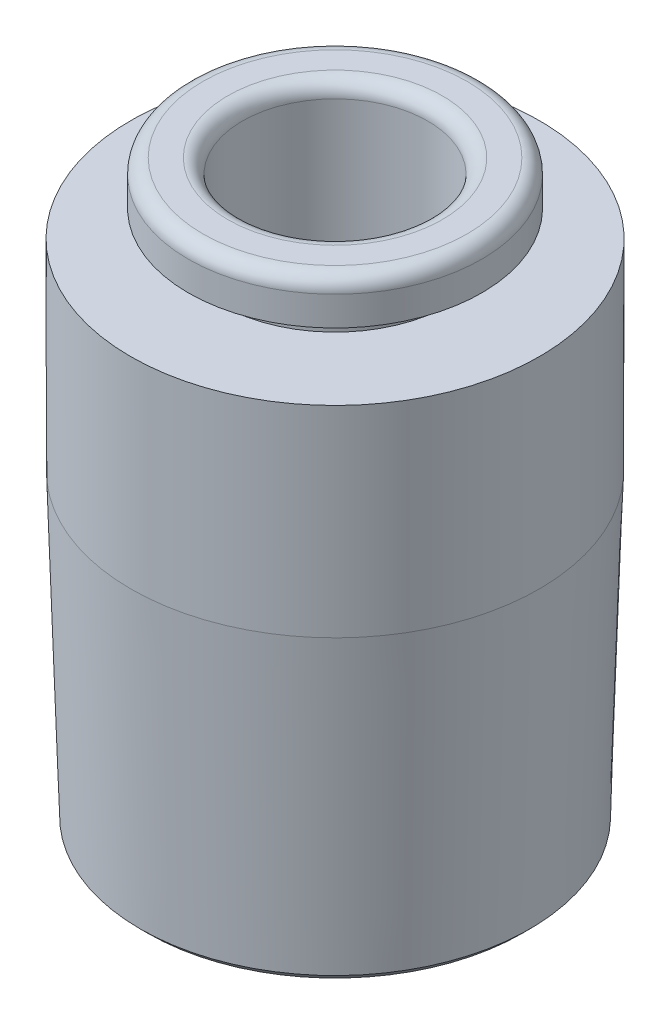
ISO-10303-21;
HEADER;
FILE_DESCRIPTION(('STEP AP214'),'2;1');
FILE_NAME('part.step','',(''),(''),'','','');
FILE_SCHEMA(('AUTOMOTIVE_DESIGN { 1 0 10303 214 1 1 1 1 }'));
ENDSEC;
DATA;
#1=APPLICATION_CONTEXT('core data for automotive mechanical design processes');
#2=APPLICATION_PROTOCOL_DEFINITION('international standard','automotive_design',2000,#1);
#3=PRODUCT_CONTEXT('',#1,'mechanical');
#4=PRODUCT('Part','Part','',(#3));
#5=PRODUCT_RELATED_PRODUCT_CATEGORY('part','',(#4));
#6=PRODUCT_DEFINITION_FORMATION('','',#4);
#7=PRODUCT_DEFINITION_CONTEXT('part definition',#1,'design');
#8=PRODUCT_DEFINITION('design','',#6,#7);
#9=PRODUCT_DEFINITION_SHAPE('','',#8);
#10=(LENGTH_UNIT() NAMED_UNIT(*) SI_UNIT(.MILLI.,.METRE.));
#11=(NAMED_UNIT(*) PLANE_ANGLE_UNIT() SI_UNIT($,.RADIAN.));
#12=(NAMED_UNIT(*) SI_UNIT($,.STERADIAN.) SOLID_ANGLE_UNIT());
#13=UNCERTAINTY_MEASURE_WITH_UNIT(LENGTH_MEASURE(1.E-05),#10,'distance_accuracy_value','');
#14=(GEOMETRIC_REPRESENTATION_CONTEXT(3) GLOBAL_UNCERTAINTY_ASSIGNED_CONTEXT((#13)) GLOBAL_UNIT_ASSIGNED_CONTEXT((#10,
#11,#12)) REPRESENTATION_CONTEXT('',''));
#15=CARTESIAN_POINT('',(0.,0.,0.));
#16=DIRECTION('',(0.,0.,1.));
#17=DIRECTION('',(1.,0.,0.));
#18=AXIS2_PLACEMENT_3D('',#15,#16,#17);
#19=CARTESIAN_POINT('',(0.,-15.3,4.76));
#20=DIRECTION('',(0.,-1.,0.));
#21=DIRECTION('',(0.,0.,-1.));
#22=AXIS2_PLACEMENT_3D('',#19,#20,#21);
#23=PLANE('',#22);
#24=DIRECTION('',(-1.,0.,0.));
#25=VECTOR('',#24,1.);
#26=CARTESIAN_POINT('',(1.37409364067131,-15.3,-2.3101584610165));
#27=LINE('',#26,#25);
#28=CARTESIAN_POINT('',(1.33377060933857,-15.3,-2.3101584610165));
#29=VERTEX_POINT('',#28);
#30=CARTESIAN_POINT('',(0.,-15.3,-2.3101584610165));
#31=VERTEX_POINT('',#30);
#32=EDGE_CURVE('E149',#29,#31,#27,.T.);
#33=ORIENTED_EDGE('',*,*,#32,.T.);
#34=CARTESIAN_POINT('',(0.,-15.3,0.));
#35=DIRECTION('',(0.,-1.,0.));
#36=DIRECTION('',(0.,0.,-1.));
#37=AXIS2_PLACEMENT_3D('',#34,#35,#36);
#38=CIRCLE('',#37,2.3101584610165);
#39=CARTESIAN_POINT('',(2.00065591400786,-15.3,-1.15507923050825));
#40=VERTEX_POINT('',#39);
#41=EDGE_CURVE('E11',#31,#40,#38,.T.);
#42=ORIENTED_EDGE('',*,*,#41,.T.);
#43=DIRECTION('',(-0.5,0.,-0.866025403784439));
#44=VECTOR('',#43,1.);
#45=CARTESIAN_POINT('',(2.68770273434351,-15.3,0.0349207694917477));
#46=LINE('',#45,#44);
#47=EDGE_CURVE('E156',#40,#29,#46,.T.);
#48=ORIENTED_EDGE('',*,*,#47,.T.);
#49=EDGE_LOOP('',(#33,#42,#48));
#50=FACE_BOUND('',#49,.T.);
#51=ADVANCED_FACE('F37',(#50),#23,.F.);
#52=CARTESIAN_POINT('',(2.66754121867714,-15.3,0.));
#53=VERTEX_POINT('',#52);
#54=EDGE_CURVE('E153',#53,#40,#46,.T.);
#55=ORIENTED_EDGE('',*,*,#54,.T.);
#56=CARTESIAN_POINT('',(2.00065591400786,-15.3,1.15507923050825));
#57=VERTEX_POINT('',#56);
#58=EDGE_CURVE('E46',#40,#57,#38,.T.);
#59=ORIENTED_EDGE('',*,*,#58,.T.);
#60=DIRECTION('',(0.5,0.,-0.866025403784438));
#61=VECTOR('',#60,1.);
#62=CARTESIAN_POINT('',(1.3136090936722,-15.3,2.34507923050825));
#63=LINE('',#62,#61);
#64=EDGE_CURVE('E255',#57,#53,#63,.T.);
#65=ORIENTED_EDGE('',*,*,#64,.T.);
#66=EDGE_LOOP('',(#55,#59,#65));
#67=FACE_BOUND('',#66,.T.);
#68=ADVANCED_FACE('F277',(#67),#23,.F.);
#69=CARTESIAN_POINT('',(1.33377060933857,-15.3,2.3101584610165));
#70=VERTEX_POINT('',#69);
#71=EDGE_CURVE('E123',#70,#57,#63,.T.);
#72=ORIENTED_EDGE('',*,*,#71,.T.);
#73=CARTESIAN_POINT('',(0.,-15.3,0.));
#74=DIRECTION('',(0.,1.,0.));
#75=DIRECTION('',(0.,0.,1.));
#76=AXIS2_PLACEMENT_3D('',#73,#74,#75);
#77=CIRCLE('',#76,2.3101584610165);
#78=CARTESIAN_POINT('',(0.,-15.3,2.3101584610165));
#79=VERTEX_POINT('',#78);
#80=EDGE_CURVE('E109',#79,#57,#77,.T.);
#81=ORIENTED_EDGE('',*,*,#80,.F.);
#82=DIRECTION('',(1.,0.,0.));
#83=VECTOR('',#82,1.);
#84=CARTESIAN_POINT('',(-1.37409364067131,-15.3,2.3101584610165));
#85=LINE('',#84,#83);
#86=EDGE_CURVE('E120',#79,#70,#85,.T.);
#87=ORIENTED_EDGE('',*,*,#86,.T.);
#88=EDGE_LOOP('',(#72,#81,#87));
#89=FACE_BOUND('',#88,.T.);
#90=ADVANCED_FACE('F119',(#89),#23,.F.);
#91=CARTESIAN_POINT('',(-1.33377060933857,-15.3,2.3101584610165));
#92=VERTEX_POINT('',#91);
#93=EDGE_CURVE('E130',#92,#79,#85,.T.);
#94=ORIENTED_EDGE('',*,*,#93,.T.);
#95=CARTESIAN_POINT('',(-2.00065591400786,-15.3,1.15507923050825));
#96=VERTEX_POINT('',#95);
#97=EDGE_CURVE('E106',#79,#96,#38,.T.);
#98=ORIENTED_EDGE('',*,*,#97,.T.);
#99=DIRECTION('',(0.5,0.,0.866025403784439));
#100=VECTOR('',#99,1.);
#101=CARTESIAN_POINT('',(-2.68770273434351,-15.3,-0.0349207694917475));
#102=LINE('',#101,#100);
#103=EDGE_CURVE('E135',#96,#92,#102,.T.);
#104=ORIENTED_EDGE('',*,*,#103,.T.);
#105=EDGE_LOOP('',(#94,#98,#104));
#106=FACE_BOUND('',#105,.T.);
#107=ADVANCED_FACE('F134',(#106),#23,.F.);
#108=CARTESIAN_POINT('',(-2.66754121867714,-15.3,0.));
#109=VERTEX_POINT('',#108);
#110=EDGE_CURVE('E132',#109,#96,#102,.T.);
#111=ORIENTED_EDGE('',*,*,#110,.T.);
#112=CARTESIAN_POINT('',(-2.00065591400786,-15.3,-1.15507923050825));
#113=VERTEX_POINT('',#112);
#114=EDGE_CURVE('E112',#96,#113,#38,.T.);
#115=ORIENTED_EDGE('',*,*,#114,.T.);
#116=DIRECTION('',(-0.5,0.,0.866025403784439));
#117=VECTOR('',#116,1.);
#118=CARTESIAN_POINT('',(-1.3136090936722,-15.3,-2.34507923050825));
#119=LINE('',#118,#117);
#120=EDGE_CURVE('E148',#113,#109,#119,.T.);
#121=ORIENTED_EDGE('',*,*,#120,.T.);
#122=EDGE_LOOP('',(#111,#115,#121));
#123=FACE_BOUND('',#122,.T.);
#124=ADVANCED_FACE('F228',(#123),#23,.F.);
#125=CARTESIAN_POINT('',(0.,0.,0.));
#126=DIRECTION('',(0.,1.,0.));
#127=DIRECTION('',(0.,0.,1.));
#128=AXIS2_PLACEMENT_3D('',#125,#126,#127);
#129=CYLINDRICAL_SURFACE('',#128,3.925);
#130=CARTESIAN_POINT('',(0.,-2.4,0.));
#131=DIRECTION('',(0.,1.,0.));
#132=DIRECTION('',(0.,0.,1.));
#133=AXIS2_PLACEMENT_3D('',#130,#131,#132);
#134=CIRCLE('',#133,3.925);
#135=CARTESIAN_POINT('',(0.,-2.4,3.925));
#136=VERTEX_POINT('',#135);
#137=EDGE_CURVE('E354',#136,#136,#134,.F.);
#138=ORIENTED_EDGE('',*,*,#137,.F.);
#139=EDGE_LOOP('',(#138));
#140=FACE_BOUND('',#139,.T.);
#141=CARTESIAN_POINT('',(0.,-1.5,0.));
#142=DIRECTION('',(0.,1.,0.));
#143=DIRECTION('',(0.,0.,1.));
#144=AXIS2_PLACEMENT_3D('',#141,#142,#143);
#145=CIRCLE('',#144,3.925);
#146=CARTESIAN_POINT('',(0.,-1.5,3.925));
#147=VERTEX_POINT('',#146);
#148=EDGE_CURVE('E215',#147,#147,#145,.T.);
#149=ORIENTED_EDGE('',*,*,#148,.F.);
#150=EDGE_LOOP('',(#149));
#151=FACE_BOUND('',#150,.T.);
#152=ADVANCED_FACE('F329',(#140,#151),#129,.T.);
#153=CARTESIAN_POINT('',(-5.025,-1.5,0.));
#154=DIRECTION('',(0.,-1.,0.));
#155=DIRECTION('',(0.,0.,-1.));
#156=AXIS2_PLACEMENT_3D('',#153,#154,#155);
#157=PLANE('',#156);
#158=ORIENTED_EDGE('',*,*,#148,.T.);
#159=EDGE_LOOP('',(#158));
#160=FACE_BOUND('',#159,.T.);
#161=CARTESIAN_POINT('',(0.,-1.5,0.));
#162=DIRECTION('',(0.,1.,0.));
#163=DIRECTION('',(0.,0.,1.));
#164=AXIS2_PLACEMENT_3D('',#161,#162,#163);
#165=CIRCLE('',#164,5.025);
#166=CARTESIAN_POINT('',(0.,-1.5,5.025));
#167=VERTEX_POINT('',#166);
#168=EDGE_CURVE('E356',#167,#167,#165,.T.);
#169=ORIENTED_EDGE('',*,*,#168,.F.);
#170=EDGE_LOOP('',(#169));
#171=FACE_BOUND('',#170,.T.);
#172=ADVANCED_FACE('F332',(#160,#171),#157,.T.);
#173=CARTESIAN_POINT('',(0.,0.,0.));
#174=DIRECTION('',(0.,1.,0.));
#175=DIRECTION('',(0.,0.,1.));
#176=AXIS2_PLACEMENT_3D('',#173,#174,#175);
#177=CYLINDRICAL_SURFACE('',#176,5.025);
#178=ORIENTED_EDGE('',*,*,#168,.T.);
#179=EDGE_LOOP('',(#178));
#180=FACE_BOUND('',#179,.T.);
#181=CARTESIAN_POINT('',(0.,-0.500000000000001,0.));
#182=DIRECTION('',(0.,1.,0.));
#183=DIRECTION('',(0.,0.,1.));
#184=AXIS2_PLACEMENT_3D('',#181,#182,#183);
#185=CIRCLE('',#184,5.025);
#186=CARTESIAN_POINT('',(0.,-0.500000000000001,5.025));
#187=VERTEX_POINT('',#186);
#188=EDGE_CURVE('E349',#187,#187,#185,.T.);
#189=ORIENTED_EDGE('',*,*,#188,.F.);
#190=EDGE_LOOP('',(#189));
#191=FACE_BOUND('',#190,.T.);
#192=ADVANCED_FACE('F336',(#180,#191),#177,.T.);
#193=CARTESIAN_POINT('',(0.,-0.500000000000001,0.));
#194=DIRECTION('',(0.,1.,0.));
#195=DIRECTION('',(0.,0.,1.));
#196=AXIS2_PLACEMENT_3D('',#193,#194,#195);
#197=TOROIDAL_SURFACE('',#196,4.525,0.5);
#198=ORIENTED_EDGE('',*,*,#188,.T.);
#199=EDGE_LOOP('',(#198));
#200=FACE_BOUND('',#199,.T.);
#201=CARTESIAN_POINT('',(0.,0.,0.));
#202=DIRECTION('',(0.,1.,0.));
#203=DIRECTION('',(0.,0.,1.));
#204=AXIS2_PLACEMENT_3D('',#201,#202,#203);
#205=CIRCLE('',#204,4.525);
#206=CARTESIAN_POINT('',(0.,0.,4.525));
#207=VERTEX_POINT('',#206);
#208=EDGE_CURVE('E352',#207,#207,#205,.T.);
#209=ORIENTED_EDGE('',*,*,#208,.F.);
#210=EDGE_LOOP('',(#209));
#211=FACE_BOUND('',#210,.T.);
#212=ADVANCED_FACE('F339',(#200,#211),#197,.T.);
#213=CARTESIAN_POINT('',(0.,0.,0.));
#214=DIRECTION('',(0.,1.,0.));
#215=DIRECTION('',(0.,0.,1.));
#216=AXIS2_PLACEMENT_3D('',#213,#214,#215);
#217=PLANE('',#216);
#218=CARTESIAN_POINT('',(0.,0.,0.));
#219=DIRECTION('',(0.,1.,0.));
#220=DIRECTION('',(0.,0.,1.));
#221=AXIS2_PLACEMENT_3D('',#218,#219,#220);
#222=CIRCLE('',#221,3.675);
#223=CARTESIAN_POINT('',(0.,0.,3.675));
#224=VERTEX_POINT('',#223);
#225=EDGE_CURVE('E220',#224,#224,#222,.F.);
#226=ORIENTED_EDGE('',*,*,#225,.T.);
#227=EDGE_LOOP('',(#226));
#228=FACE_BOUND('',#227,.T.);
#229=ORIENTED_EDGE('',*,*,#208,.T.);
#230=EDGE_LOOP('',(#229));
#231=FACE_BOUND('',#230,.T.);
#232=ADVANCED_FACE('F197',(#228,#231),#217,.T.);
#233=CARTESIAN_POINT('',(0.,-29.0989898732233,0.));
#234=DIRECTION('',(0.,1.,0.));
#235=DIRECTION('',(0.,0.,1.));
#236=AXIS2_PLACEMENT_3D('',#233,#234,#235);
#237=CYLINDRICAL_SURFACE('',#236,7.);
#238=CARTESIAN_POINT('',(0.,-9.3,0.));
#239=DIRECTION('',(0.,-1.,0.));
#240=DIRECTION('',(0.,0.,1.));
#241=AXIS2_PLACEMENT_3D('',#238,#239,#240);
#242=CIRCLE('',#241,6.98984886267211);
#243=CARTESIAN_POINT('',(0.,-9.3,6.98984886267211));
#244=VERTEX_POINT('',#243);
#245=EDGE_CURVE('E165',#244,#244,#242,.T.);
#246=ORIENTED_EDGE('',*,*,#245,.F.);
#247=EDGE_LOOP('',(#246));
#248=FACE_BOUND('',#247,.T.);
#249=CARTESIAN_POINT('',(0.,-2.4,0.));
#250=DIRECTION('',(0.,1.,0.));
#251=DIRECTION('',(0.,0.,1.));
#252=AXIS2_PLACEMENT_3D('',#249,#250,#251);
#253=CIRCLE('',#252,7.);
#254=CARTESIAN_POINT('',(0.,-2.4,7.));
#255=VERTEX_POINT('',#254);
#256=EDGE_CURVE('E160',#255,#255,#253,.T.);
#257=ORIENTED_EDGE('',*,*,#256,.F.);
#258=EDGE_LOOP('',(#257));
#259=FACE_BOUND('',#258,.T.);
#260=ADVANCED_FACE('F192',(#248,#259),#237,.T.);
#261=CARTESIAN_POINT('',(0.,-2.4,0.));
#262=DIRECTION('',(0.,1.,0.));
#263=DIRECTION('',(0.,0.,1.));
#264=AXIS2_PLACEMENT_3D('',#261,#262,#263);
#265=PLANE('',#264);
#266=ORIENTED_EDGE('',*,*,#137,.T.);
#267=EDGE_LOOP('',(#266));
#268=FACE_BOUND('',#267,.T.);
#269=ORIENTED_EDGE('',*,*,#256,.T.);
#270=EDGE_LOOP('',(#269));
#271=FACE_BOUND('',#270,.T.);
#272=ADVANCED_FACE('F188',(#268,#271),#265,.T.);
#273=CARTESIAN_POINT('',(-6.66280809250348,-19.8,0.));
#274=DIRECTION('',(0.,-1.,0.));
#275=DIRECTION('',(0.,0.,-1.));
#276=AXIS2_PLACEMENT_3D('',#273,#274,#275);
#277=PLANE('',#276);
#278=CARTESIAN_POINT('',(0.,-19.8,0.));
#279=DIRECTION('',(0.,1.,0.));
#280=DIRECTION('',(0.,0.,1.));
#281=AXIS2_PLACEMENT_3D('',#278,#279,#280);
#282=CIRCLE('',#281,2.3101584610165);
#283=CARTESIAN_POINT('',(0.,-19.8,2.3101584610165));
#284=VERTEX_POINT('',#283);
#285=EDGE_CURVE('E124',#284,#284,#282,.T.);
#286=ORIENTED_EDGE('',*,*,#285,.T.);
#287=EDGE_LOOP('',(#286));
#288=FACE_BOUND('',#287,.T.);
#289=CARTESIAN_POINT('',(0.,-19.8,0.));
#290=DIRECTION('',(0.,-1.,0.));
#291=DIRECTION('',(0.,0.,-1.));
#292=AXIS2_PLACEMENT_3D('',#289,#290,#291);
#293=CIRCLE('',#292,6.41280809250348);
#294=CARTESIAN_POINT('',(0.,-19.8,-6.41280809250348));
#295=VERTEX_POINT('',#294);
#296=EDGE_CURVE('E214',#295,#295,#293,.T.);
#297=ORIENTED_EDGE('',*,*,#296,.T.);
#298=EDGE_LOOP('',(#297));
#299=FACE_BOUND('',#298,.T.);
#300=ADVANCED_FACE('F182',(#288,#299),#277,.T.);
#301=CARTESIAN_POINT('',(0.,-9.3,0.));
#302=DIRECTION('',(0.,1.,0.));
#303=DIRECTION('',(0.,0.,1.));
#304=AXIS2_PLACEMENT_3D('',#301,#302,#303);
#305=CONICAL_SURFACE('',#304,6.98984886267211,0.0311366738555833);
#306=CARTESIAN_POINT('',(0.,-19.5419629882815,0.));
#307=DIRECTION('',(0.,-1.,0.));
#308=DIRECTION('',(0.,0.,-1.));
#309=AXIS2_PLACEMENT_3D('',#306,#307,#308);
#310=CIRCLE('',#309,6.670845104222);
#311=CARTESIAN_POINT('',(0.,-19.5419629882815,-6.670845104222));
#312=VERTEX_POINT('',#311);
#313=EDGE_CURVE('E206',#312,#312,#310,.F.);
#314=ORIENTED_EDGE('',*,*,#313,.T.);
#315=EDGE_LOOP('',(#314));
#316=FACE_BOUND('',#315,.T.);
#317=ORIENTED_EDGE('',*,*,#245,.T.);
#318=EDGE_LOOP('',(#317));
#319=FACE_BOUND('',#318,.T.);
#320=ADVANCED_FACE('F171',(#316,#319),#305,.T.);
#321=CARTESIAN_POINT('',(0.,-19.5419629882815,0.));
#322=DIRECTION('',(0.,1.,0.));
#323=DIRECTION('',(0.,0.,1.));
#324=AXIS2_PLACEMENT_3D('',#321,#322,#323);
#325=CONICAL_SURFACE('',#324,6.670845104222,0.785398163397447);
#326=ORIENTED_EDGE('',*,*,#296,.F.);
#327=EDGE_LOOP('',(#326));
#328=FACE_BOUND('',#327,.T.);
#329=ORIENTED_EDGE('',*,*,#313,.F.);
#330=EDGE_LOOP('',(#329));
#331=FACE_BOUND('',#330,.T.);
#332=ADVANCED_FACE('F181',(#328,#331),#325,.T.);
#333=CARTESIAN_POINT('',(0.,-22.2802561210692,0.));
#334=DIRECTION('',(0.,1.,0.));
#335=DIRECTION('',(0.,0.,1.));
#336=AXIS2_PLACEMENT_3D('',#333,#334,#335);
#337=CYLINDRICAL_SURFACE('',#336,3.175);
#338=CARTESIAN_POINT('',(0.,-0.5,0.));
#339=DIRECTION('',(0.,1.,0.));
#340=DIRECTION('',(0.,0.,1.));
#341=AXIS2_PLACEMENT_3D('',#338,#339,#340);
#342=CIRCLE('',#341,3.175);
#343=CARTESIAN_POINT('',(0.,-0.5,3.175));
#344=VERTEX_POINT('',#343);
#345=EDGE_CURVE('E218',#344,#344,#342,.T.);
#346=CARTESIAN_POINT('',(0.,-13.3,0.));
#347=DIRECTION('',(0.,1.,0.));
#348=DIRECTION('',(0.,0.,1.));
#349=AXIS2_PLACEMENT_3D('',#346,#347,#348);
#350=CIRCLE('',#349,3.175);
#351=CARTESIAN_POINT('',(0.,-13.3,3.175));
#352=VERTEX_POINT('',#351);
#353=EDGE_CURVE('E157',#352,#352,#350,.F.);
#354=CARTESIAN_POINT('',(0.,-0.5,3.175));
#355=CARTESIAN_POINT('',(0.,-0.633333333333334,3.175));
#356=CARTESIAN_POINT('',(0.,-0.766666666666668,3.175));
#357=CARTESIAN_POINT('',(0.,-1.03333333333333,3.175));
#358=CARTESIAN_POINT('',(0.,-1.16666666666667,3.175));
#359=CARTESIAN_POINT('',(0.,-1.43333333333333,3.175));
#360=CARTESIAN_POINT('',(0.,-1.56666666666667,3.175));
#361=CARTESIAN_POINT('',(0.,-1.83333333333333,3.175));
#362=CARTESIAN_POINT('',(0.,-1.96666666666667,3.175));
#363=CARTESIAN_POINT('',(0.,-2.23333333333334,3.175));
#364=CARTESIAN_POINT('',(0.,-2.36666666666667,3.175));
#365=CARTESIAN_POINT('',(0.,-2.63333333333333,3.175));
#366=CARTESIAN_POINT('',(0.,-2.76666666666667,3.175));
#367=CARTESIAN_POINT('',(0.,-3.03333333333333,3.175));
#368=CARTESIAN_POINT('',(0.,-3.16666666666667,3.175));
#369=CARTESIAN_POINT('',(0.,-3.43333333333333,3.175));
#370=CARTESIAN_POINT('',(0.,-3.56666666666667,3.175));
#371=CARTESIAN_POINT('',(0.,-3.83333333333333,3.175));
#372=CARTESIAN_POINT('',(0.,-3.96666666666667,3.175));
#373=CARTESIAN_POINT('',(0.,-4.23333333333333,3.175));
#374=CARTESIAN_POINT('',(0.,-4.36666666666667,3.175));
#375=CARTESIAN_POINT('',(0.,-4.63333333333333,3.175));
#376=CARTESIAN_POINT('',(0.,-4.76666666666667,3.175));
#377=CARTESIAN_POINT('',(0.,-5.03333333333333,3.175));
#378=CARTESIAN_POINT('',(0.,-5.16666666666667,3.175));
#379=CARTESIAN_POINT('',(0.,-5.43333333333333,3.175));
#380=CARTESIAN_POINT('',(0.,-5.56666666666667,3.175));
#381=CARTESIAN_POINT('',(0.,-5.83333333333333,3.175));
#382=CARTESIAN_POINT('',(0.,-5.96666666666667,3.175));
#383=CARTESIAN_POINT('',(0.,-6.23333333333333,3.175));
#384=CARTESIAN_POINT('',(0.,-6.36666666666667,3.175));
#385=CARTESIAN_POINT('',(0.,-6.63333333333333,3.175));
#386=CARTESIAN_POINT('',(0.,-6.76666666666667,3.175));
#387=CARTESIAN_POINT('',(0.,-7.03333333333333,3.175));
#388=CARTESIAN_POINT('',(0.,-7.16666666666667,3.175));
#389=CARTESIAN_POINT('',(0.,-7.43333333333333,3.175));
#390=CARTESIAN_POINT('',(0.,-7.56666666666667,3.175));
#391=CARTESIAN_POINT('',(0.,-7.83333333333333,3.175));
#392=CARTESIAN_POINT('',(0.,-7.96666666666667,3.175));
#393=CARTESIAN_POINT('',(0.,-8.23333333333333,3.175));
#394=CARTESIAN_POINT('',(0.,-8.36666666666667,3.175));
#395=CARTESIAN_POINT('',(0.,-8.63333333333333,3.175));
#396=CARTESIAN_POINT('',(0.,-8.76666666666667,3.175));
#397=CARTESIAN_POINT('',(0.,-9.03333333333333,3.175));
#398=CARTESIAN_POINT('',(0.,-9.16666666666667,3.175));
#399=CARTESIAN_POINT('',(0.,-9.43333333333333,3.175));
#400=CARTESIAN_POINT('',(0.,-9.56666666666667,3.175));
#401=CARTESIAN_POINT('',(0.,-9.83333333333333,3.175));
#402=CARTESIAN_POINT('',(0.,-9.96666666666667,3.175));
#403=CARTESIAN_POINT('',(0.,-10.2333333333333,3.175));
#404=CARTESIAN_POINT('',(0.,-10.3666666666667,3.175));
#405=CARTESIAN_POINT('',(0.,-10.6333333333333,3.175));
#406=CARTESIAN_POINT('',(0.,-10.7666666666667,3.175));
#407=CARTESIAN_POINT('',(0.,-11.0333333333333,3.175));
#408=CARTESIAN_POINT('',(0.,-11.1666666666667,3.175));
#409=CARTESIAN_POINT('',(0.,-11.4333333333333,3.175));
#410=CARTESIAN_POINT('',(0.,-11.5666666666667,3.175));
#411=CARTESIAN_POINT('',(0.,-11.8333333333333,3.175));
#412=CARTESIAN_POINT('',(0.,-11.9666666666667,3.175));
#413=CARTESIAN_POINT('',(0.,-12.2333333333333,3.175));
#414=CARTESIAN_POINT('',(0.,-12.3666666666667,3.175));
#415=CARTESIAN_POINT('',(0.,-12.6333333333333,3.175));
#416=CARTESIAN_POINT('',(0.,-12.7666666666667,3.175));
#417=CARTESIAN_POINT('',(0.,-13.0333333333333,3.175));
#418=CARTESIAN_POINT('',(0.,-13.1666666666667,3.175));
#419=CARTESIAN_POINT('',(0.,-13.3,3.175));
#420=B_SPLINE_CURVE_WITH_KNOTS('',3,(#354,#355,#356,#357,#358,#359,#360,#361,#362,#363,#364,
#365,#366,#367,#368,#369,#370,#371,#372,#373,#374,#375,#376,#377,#378,#379,#380,#381,#382,#383,
#384,#385,#386,#387,#388,#389,#390,#391,#392,#393,#394,#395,#396,#397,#398,#399,#400,#401,#402,
#403,#404,#405,#406,#407,#408,#409,#410,#411,#412,#413,#414,#415,#416,#417,#418,#419),
.UNSPECIFIED.,.F.,.F.,(4,2,2,2,2,2,2,2,2,2,2,2,2,2,2,2,2,2,2,2,2,2,2,2,2,2,2,2,2,2,2,2,4),(0.,
0.400000000000001,0.799999999999999,1.2,1.6,2.,2.4,2.8,3.2,3.6,4.,4.4,4.8,5.2,5.6,6.,6.4,6.8,
7.2,7.6,8.,8.4,8.8,9.2,9.6,10.,10.4,10.8,11.2,11.6,12.,12.4,12.8),.UNSPECIFIED.);
#421=EDGE_CURVE('BSEAM184',#344,#352,#420,.T.);
#422=ORIENTED_EDGE('',*,*,#345,.T.);
#423=ORIENTED_EDGE('',*,*,#353,.T.);
#424=ORIENTED_EDGE('',*,*,#421,.T.);
#425=ORIENTED_EDGE('',*,*,#421,.F.);
#426=EDGE_LOOP('',(#422,#424,#423,#425));
#427=FACE_BOUND('',#426,.T.);
#428=ADVANCED_FACE('F184',(#427),#337,.F.);
#429=CARTESIAN_POINT('',(0.,-13.3,0.));
#430=DIRECTION('',(0.,1.,0.));
#431=DIRECTION('',(0.,0.,1.));
#432=AXIS2_PLACEMENT_3D('',#429,#430,#431);
#433=PLANE('',#432);
#434=DIRECTION('',(0.5,0.,-0.866025403784439));
#435=VECTOR('',#434,1.);
#436=CARTESIAN_POINT('',(1.37409364067131,-13.3,2.38));
#437=LINE('',#436,#435);
#438=CARTESIAN_POINT('',(1.37409364067131,-13.3,2.38));
#439=VERTEX_POINT('',#438);
#440=CARTESIAN_POINT('',(2.74818728134262,-13.3,0.));
#441=VERTEX_POINT('',#440);
#442=EDGE_CURVE('E59',#439,#441,#437,.T.);
#443=ORIENTED_EDGE('',*,*,#442,.F.);
#444=DIRECTION('',(1.,0.,0.));
#445=VECTOR('',#444,1.);
#446=CARTESIAN_POINT('',(-1.37409364067131,-13.3,2.38));
#447=LINE('',#446,#445);
#448=CARTESIAN_POINT('',(-1.37409364067131,-13.3,2.38));
#449=VERTEX_POINT('',#448);
#450=EDGE_CURVE('E253',#449,#439,#447,.T.);
#451=ORIENTED_EDGE('',*,*,#450,.F.);
#452=DIRECTION('',(0.5,0.,0.866025403784439));
#453=VECTOR('',#452,1.);
#454=CARTESIAN_POINT('',(-2.74818728134262,-13.3,0.));
#455=LINE('',#454,#453);
#456=CARTESIAN_POINT('',(-2.74818728134262,-13.3,0.));
#457=VERTEX_POINT('',#456);
#458=EDGE_CURVE('E256',#457,#449,#455,.T.);
#459=ORIENTED_EDGE('',*,*,#458,.F.);
#460=DIRECTION('',(-0.5,0.,0.866025403784439));
#461=VECTOR('',#460,1.);
#462=CARTESIAN_POINT('',(-1.37409364067131,-13.3,-2.38));
#463=LINE('',#462,#461);
#464=CARTESIAN_POINT('',(-1.37409364067131,-13.3,-2.38));
#465=VERTEX_POINT('',#464);
#466=EDGE_CURVE('E258',#465,#457,#463,.T.);
#467=ORIENTED_EDGE('',*,*,#466,.F.);
#468=DIRECTION('',(-1.,0.,0.));
#469=VECTOR('',#468,1.);
#470=CARTESIAN_POINT('',(1.37409364067131,-13.3,-2.38));
#471=LINE('',#470,#469);
#472=CARTESIAN_POINT('',(1.37409364067131,-13.3,-2.38));
#473=VERTEX_POINT('',#472);
#474=EDGE_CURVE('E244',#473,#465,#471,.T.);
#475=ORIENTED_EDGE('',*,*,#474,.F.);
#476=DIRECTION('',(-0.5,0.,-0.866025403784439));
#477=VECTOR('',#476,1.);
#478=CARTESIAN_POINT('',(2.74818728134262,-13.3,0.));
#479=LINE('',#478,#477);
#480=EDGE_CURVE('E261',#441,#473,#479,.T.);
#481=ORIENTED_EDGE('',*,*,#480,.F.);
#482=EDGE_LOOP('',(#443,#451,#459,#467,#475,#481));
#483=FACE_BOUND('',#482,.T.);
#484=ORIENTED_EDGE('',*,*,#353,.F.);
#485=EDGE_LOOP('',(#484));
#486=FACE_BOUND('',#485,.T.);
#487=ADVANCED_FACE('F299',(#483,#486),#433,.T.);
#488=CARTESIAN_POINT('',(0.,-0.5,0.));
#489=DIRECTION('',(0.,1.,0.));
#490=DIRECTION('',(0.,0.,1.));
#491=AXIS2_PLACEMENT_3D('',#488,#489,#490);
#492=TOROIDAL_SURFACE('',#491,3.675,0.5);
#493=ORIENTED_EDGE('',*,*,#225,.F.);
#494=EDGE_LOOP('',(#493));
#495=FACE_BOUND('',#494,.T.);
#496=ORIENTED_EDGE('',*,*,#345,.F.);
#497=EDGE_LOOP('',(#496));
#498=FACE_BOUND('',#497,.T.);
#499=ADVANCED_FACE('F39',(#495,#498),#492,.T.);
#500=CARTESIAN_POINT('',(1.37409364067131,-13.3,2.38));
#501=DIRECTION('',(0.865497844507676,-0.034899496702501,0.499695413509548));
#502=DIRECTION('',(0.5,0.,-0.866025403784438));
#503=AXIS2_PLACEMENT_3D('',#500,#501,#502);
#504=PLANE('',#503);
#505=ORIENTED_EDGE('',*,*,#442,.T.);
#506=DIRECTION('',(0.0402902897014406,0.999188016619382,0.));
#507=VECTOR('',#506,1.);
#508=CARTESIAN_POINT('',(2.74595670490665,-13.3553176773234,0.));
#509=LINE('',#508,#507);
#510=EDGE_CURVE('E137',#53,#441,#509,.T.);
#511=ORIENTED_EDGE('',*,*,#510,.F.);
#512=ORIENTED_EDGE('',*,*,#64,.F.);
#513=ORIENTED_EDGE('',*,*,#71,.F.);
#514=DIRECTION('',(0.0201451448507203,0.999188016619382,0.0348924144072821));
#515=VECTOR('',#514,1.);
#516=CARTESIAN_POINT('',(1.37297835245333,-13.3553176773234,2.37806826414137));
#517=LINE('',#516,#515);
#518=EDGE_CURVE('E131',#70,#439,#517,.T.);
#519=ORIENTED_EDGE('',*,*,#518,.T.);
#520=EDGE_LOOP('',(#505,#511,#512,#513,#519));
#521=FACE_BOUND('',#520,.T.);
#522=ADVANCED_FACE('F284',(#521),#504,.F.);
#523=CARTESIAN_POINT('',(-1.37409364067131,-13.3,2.38));
#524=DIRECTION('',(0.,-0.034899496702501,0.999390827019096));
#525=DIRECTION('',(0.,-0.999390827019096,-0.034899496702501));
#526=AXIS2_PLACEMENT_3D('',#523,#524,#525);
#527=PLANE('',#526);
#528=ORIENTED_EDGE('',*,*,#450,.T.);
#529=ORIENTED_EDGE('',*,*,#518,.F.);
#530=ORIENTED_EDGE('',*,*,#86,.F.);
#531=ORIENTED_EDGE('',*,*,#93,.F.);
#532=DIRECTION('',(-0.0201451448507203,0.999188016619382,0.0348924144072821));
#533=VECTOR('',#532,1.);
#534=CARTESIAN_POINT('',(-1.37297835245333,-13.3553176773234,2.37806826414137));
#535=LINE('',#534,#533);
#536=EDGE_CURVE('E247',#92,#449,#535,.T.);
#537=ORIENTED_EDGE('',*,*,#536,.T.);
#538=EDGE_LOOP('',(#528,#529,#530,#531,#537));
#539=FACE_BOUND('',#538,.T.);
#540=ADVANCED_FACE('F129',(#539),#527,.F.);
#541=CARTESIAN_POINT('',(-2.74818728134262,-13.3,0.));
#542=DIRECTION('',(-0.865497844507677,-0.034899496702501,0.499695413509548));
#543=DIRECTION('',(0.5,0.,0.866025403784439));
#544=AXIS2_PLACEMENT_3D('',#541,#542,#543);
#545=PLANE('',#544);
#546=ORIENTED_EDGE('',*,*,#458,.T.);
#547=ORIENTED_EDGE('',*,*,#536,.F.);
#548=ORIENTED_EDGE('',*,*,#103,.F.);
#549=ORIENTED_EDGE('',*,*,#110,.F.);
#550=DIRECTION('',(-0.0402902897014406,0.999188016619382,0.));
#551=VECTOR('',#550,1.);
#552=CARTESIAN_POINT('',(-2.74595670490665,-13.3553176773234,0.));
#553=LINE('',#552,#551);
#554=EDGE_CURVE('E235',#109,#457,#553,.T.);
#555=ORIENTED_EDGE('',*,*,#554,.T.);
#556=EDGE_LOOP('',(#546,#547,#548,#549,#555));
#557=FACE_BOUND('',#556,.T.);
#558=ADVANCED_FACE('F294',(#557),#545,.F.);
#559=CARTESIAN_POINT('',(-1.37409364067131,-13.3,-2.38));
#560=DIRECTION('',(-0.865497844507677,-0.034899496702501,-0.499695413509548));
#561=DIRECTION('',(-0.5,0.,0.866025403784439));
#562=AXIS2_PLACEMENT_3D('',#559,#560,#561);
#563=PLANE('',#562);
#564=ORIENTED_EDGE('',*,*,#466,.T.);
#565=ORIENTED_EDGE('',*,*,#554,.F.);
#566=ORIENTED_EDGE('',*,*,#120,.F.);
#567=CARTESIAN_POINT('',(-1.33377060933857,-15.3,-2.3101584610165));
#568=VERTEX_POINT('',#567);
#569=EDGE_CURVE('E145',#568,#113,#119,.T.);
#570=ORIENTED_EDGE('',*,*,#569,.F.);
#571=DIRECTION('',(-0.0201451448507203,0.999188016619382,-0.0348924144072821));
#572=VECTOR('',#571,1.);
#573=CARTESIAN_POINT('',(-1.37297835245333,-13.3553176773234,-2.37806826414137));
#574=LINE('',#573,#572);
#575=EDGE_CURVE('E241',#568,#465,#574,.T.);
#576=ORIENTED_EDGE('',*,*,#575,.T.);
#577=EDGE_LOOP('',(#564,#565,#566,#570,#576));
#578=FACE_BOUND('',#577,.T.);
#579=ADVANCED_FACE('F234',(#578),#563,.F.);
#580=CARTESIAN_POINT('',(1.37409364067131,-13.3,-2.38));
#581=DIRECTION('',(0.,-0.034899496702501,-0.999390827019096));
#582=DIRECTION('',(0.,0.999390827019096,-0.034899496702501));
#583=AXIS2_PLACEMENT_3D('',#580,#581,#582);
#584=PLANE('',#583);
#585=ORIENTED_EDGE('',*,*,#474,.T.);
#586=ORIENTED_EDGE('',*,*,#575,.F.);
#587=EDGE_CURVE('E152',#31,#568,#27,.T.);
#588=ORIENTED_EDGE('',*,*,#587,.F.);
#589=ORIENTED_EDGE('',*,*,#32,.F.);
#590=DIRECTION('',(0.0201451448507203,0.999188016619382,-0.0348924144072821));
#591=VECTOR('',#590,1.);
#592=CARTESIAN_POINT('',(1.37297835245333,-13.3553176773234,-2.37806826414137));
#593=LINE('',#592,#591);
#594=EDGE_CURVE('E138',#29,#473,#593,.T.);
#595=ORIENTED_EDGE('',*,*,#594,.T.);
#596=EDGE_LOOP('',(#585,#586,#588,#589,#595));
#597=FACE_BOUND('',#596,.T.);
#598=ADVANCED_FACE('F242',(#597),#584,.F.);
#599=CARTESIAN_POINT('',(2.74818728134262,-13.3,0.));
#600=DIRECTION('',(0.865497844507677,-0.034899496702501,-0.499695413509547));
#601=DIRECTION('',(-0.5,0.,-0.866025403784439));
#602=AXIS2_PLACEMENT_3D('',#599,#600,#601);
#603=PLANE('',#602);
#604=ORIENTED_EDGE('',*,*,#480,.T.);
#605=ORIENTED_EDGE('',*,*,#594,.F.);
#606=ORIENTED_EDGE('',*,*,#47,.F.);
#607=ORIENTED_EDGE('',*,*,#54,.F.);
#608=ORIENTED_EDGE('',*,*,#510,.T.);
#609=EDGE_LOOP('',(#604,#605,#606,#607,#608));
#610=FACE_BOUND('',#609,.T.);
#611=ADVANCED_FACE('F274',(#610),#603,.F.);
#612=ORIENTED_EDGE('',*,*,#569,.T.);
#613=EDGE_CURVE('E41',#113,#31,#38,.T.);
#614=ORIENTED_EDGE('',*,*,#613,.T.);
#615=ORIENTED_EDGE('',*,*,#587,.T.);
#616=EDGE_LOOP('',(#612,#614,#615));
#617=FACE_BOUND('',#616,.T.);
#618=ADVANCED_FACE('F236',(#617),#23,.F.);
#619=CARTESIAN_POINT('',(0.,-19.8,0.));
#620=DIRECTION('',(0.,1.,0.));
#621=DIRECTION('',(0.,0.,1.));
#622=AXIS2_PLACEMENT_3D('',#619,#620,#621);
#623=CYLINDRICAL_SURFACE('',#622,2.3101584610165);
#624=ORIENTED_EDGE('',*,*,#285,.F.);
#625=EDGE_LOOP('',(#624));
#626=FACE_BOUND('',#625,.T.);
#627=ORIENTED_EDGE('',*,*,#80,.T.);
#628=ORIENTED_EDGE('',*,*,#58,.F.);
#629=ORIENTED_EDGE('',*,*,#41,.F.);
#630=ORIENTED_EDGE('',*,*,#613,.F.);
#631=ORIENTED_EDGE('',*,*,#114,.F.);
#632=ORIENTED_EDGE('',*,*,#97,.F.);
#633=EDGE_LOOP('',(#627,#628,#629,#630,#631,#632));
#634=FACE_BOUND('',#633,.T.);
#635=ADVANCED_FACE('F108',(#626,#634),#623,.F.);
#636=CLOSED_SHELL('',(#51,#68,#90,#107,#124,#152,#172,#192,#212,#232,#260,#272,#300,#320,#332,
#428,#487,#499,#522,#540,#558,#579,#598,#611,#618,#635));
#637=MANIFOLD_SOLID_BREP('B2',#636);
#638=ADVANCED_BREP_SHAPE_REPRESENTATION('',(#18,#637),#14);
#639=SHAPE_DEFINITION_REPRESENTATION(#9,#638);
ENDSEC;
END-ISO-10303-21;
